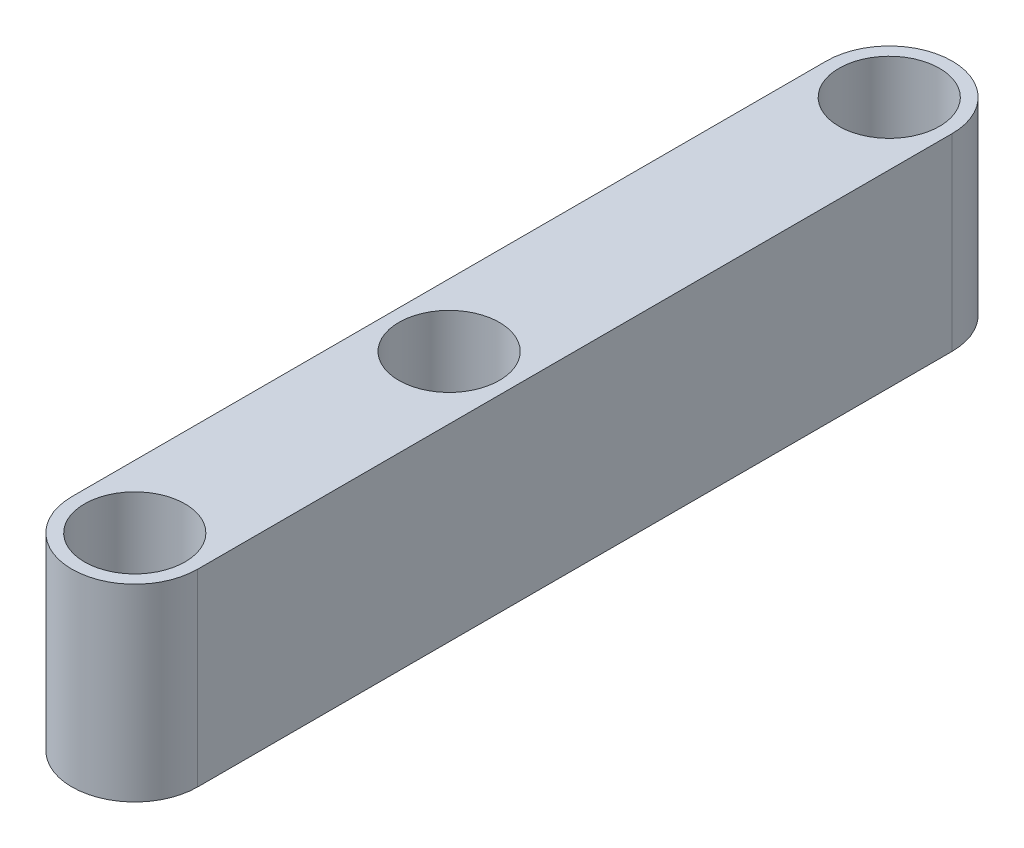
ISO-10303-21;
HEADER;
FILE_DESCRIPTION(('STEP AP214'),'2;1');
FILE_NAME('part.step','',(''),(''),'','','');
FILE_SCHEMA(('AUTOMOTIVE_DESIGN { 1 0 10303 214 1 1 1 1 }'));
ENDSEC;
DATA;
#1=APPLICATION_CONTEXT('core data for automotive mechanical design processes');
#2=APPLICATION_PROTOCOL_DEFINITION('international standard','automotive_design',2000,#1);
#3=PRODUCT_CONTEXT('',#1,'mechanical');
#4=PRODUCT('Part','Part','',(#3));
#5=PRODUCT_RELATED_PRODUCT_CATEGORY('part','',(#4));
#6=PRODUCT_DEFINITION_FORMATION('','',#4);
#7=PRODUCT_DEFINITION_CONTEXT('part definition',#1,'design');
#8=PRODUCT_DEFINITION('design','',#6,#7);
#9=PRODUCT_DEFINITION_SHAPE('','',#8);
#10=(LENGTH_UNIT() NAMED_UNIT(*) SI_UNIT(.MILLI.,.METRE.));
#11=(NAMED_UNIT(*) PLANE_ANGLE_UNIT() SI_UNIT($,.RADIAN.));
#12=(NAMED_UNIT(*) SI_UNIT($,.STERADIAN.) SOLID_ANGLE_UNIT());
#13=UNCERTAINTY_MEASURE_WITH_UNIT(LENGTH_MEASURE(1.E-05),#10,'distance_accuracy_value','');
#14=(GEOMETRIC_REPRESENTATION_CONTEXT(3) GLOBAL_UNCERTAINTY_ASSIGNED_CONTEXT((#13)) GLOBAL_UNIT_ASSIGNED_CONTEXT((#10,
#11,#12)) REPRESENTATION_CONTEXT('',''));
#15=CARTESIAN_POINT('',(0.,0.,0.));
#16=DIRECTION('',(0.,0.,1.));
#17=DIRECTION('',(1.,0.,0.));
#18=AXIS2_PLACEMENT_3D('',#15,#16,#17);
#19=CARTESIAN_POINT('',(-36.9175439934916,1.5,0.));
#20=DIRECTION('',(1.,0.,0.));
#21=DIRECTION('',(0.,0.,-1.));
#22=AXIS2_PLACEMENT_3D('',#19,#20,#21);
#23=PLANE('',#22);
#24=DIRECTION('',(0.,0.,1.));
#25=VECTOR('',#24,1.);
#26=CARTESIAN_POINT('',(-36.9175439934916,0.,0.));
#27=LINE('',#26,#25);
#28=CARTESIAN_POINT('',(-36.9175439934916,0.,-30.0020852059679));
#29=VERTEX_POINT('',#28);
#30=CARTESIAN_POINT('',(-36.9175439934916,0.,-24.0020852059679));
#31=VERTEX_POINT('',#30);
#32=EDGE_CURVE('E119',#29,#31,#27,.T.);
#33=ORIENTED_EDGE('',*,*,#32,.T.);
#34=DIRECTION('',(0.,-1.,0.));
#35=VECTOR('',#34,1.);
#36=CARTESIAN_POINT('',(-36.9175439934916,1.5,-24.0020852059679));
#37=LINE('',#36,#35);
#38=CARTESIAN_POINT('',(-36.9175439934916,1.5,-24.0020852059679));
#39=VERTEX_POINT('',#38);
#40=EDGE_CURVE('E11',#39,#31,#37,.T.);
#41=ORIENTED_EDGE('',*,*,#40,.F.);
#42=DIRECTION('',(0.,0.,1.));
#43=VECTOR('',#42,1.);
#44=CARTESIAN_POINT('',(-36.9175439934916,1.5,0.));
#45=LINE('',#44,#43);
#46=CARTESIAN_POINT('',(-36.9175439934916,1.5,-30.0020852059679));
#47=VERTEX_POINT('',#46);
#48=EDGE_CURVE('E88',#47,#39,#45,.T.);
#49=ORIENTED_EDGE('',*,*,#48,.F.);
#50=DIRECTION('',(0.,-1.,0.));
#51=VECTOR('',#50,1.);
#52=CARTESIAN_POINT('',(-36.9175439934916,1.5,-30.0020852059679));
#53=LINE('',#52,#51);
#54=EDGE_CURVE('E103',#47,#29,#53,.T.);
#55=ORIENTED_EDGE('',*,*,#54,.T.);
#56=EDGE_LOOP('',(#33,#41,#49,#55));
#57=FACE_BOUND('',#56,.T.);
#58=ADVANCED_FACE('F39',(#57),#23,.F.);
#59=CARTESIAN_POINT('',(-36.4175439934916,1.5,-24.0020852059679));
#60=DIRECTION('',(0.,-1.,0.));
#61=DIRECTION('',(0.,0.,-1.));
#62=AXIS2_PLACEMENT_3D('',#59,#60,#61);
#63=CYLINDRICAL_SURFACE('',#62,0.5);
#64=CARTESIAN_POINT('',(-36.4175439934916,0.,-24.0020852059679));
#65=DIRECTION('',(0.,1.,0.));
#66=DIRECTION('',(0.,0.,1.));
#67=AXIS2_PLACEMENT_3D('',#64,#65,#66);
#68=CIRCLE('',#67,0.5);
#69=CARTESIAN_POINT('',(-35.9175439934916,0.,-24.0020852059679));
#70=VERTEX_POINT('',#69);
#71=EDGE_CURVE('E94',#31,#70,#68,.T.);
#72=ORIENTED_EDGE('',*,*,#71,.T.);
#73=DIRECTION('',(0.,-1.,0.));
#74=VECTOR('',#73,1.);
#75=CARTESIAN_POINT('',(-35.9175439934916,1.5,-24.0020852059679));
#76=LINE('',#75,#74);
#77=CARTESIAN_POINT('',(-35.9175439934916,1.5,-24.0020852059679));
#78=VERTEX_POINT('',#77);
#79=EDGE_CURVE('E49',#78,#70,#76,.T.);
#80=ORIENTED_EDGE('',*,*,#79,.F.);
#81=CARTESIAN_POINT('',(-36.4175439934916,1.5,-24.0020852059679));
#82=DIRECTION('',(0.,1.,0.));
#83=DIRECTION('',(0.,0.,1.));
#84=AXIS2_PLACEMENT_3D('',#81,#82,#83);
#85=CIRCLE('',#84,0.5);
#86=EDGE_CURVE('E83',#39,#78,#85,.T.);
#87=ORIENTED_EDGE('',*,*,#86,.F.);
#88=ORIENTED_EDGE('',*,*,#40,.T.);
#89=EDGE_LOOP('',(#72,#80,#87,#88));
#90=FACE_BOUND('',#89,.T.);
#91=ADVANCED_FACE('F93',(#90),#63,.T.);
#92=CARTESIAN_POINT('',(-35.9175439934916,1.5,0.));
#93=DIRECTION('',(1.,0.,0.));
#94=DIRECTION('',(0.,0.,-1.));
#95=AXIS2_PLACEMENT_3D('',#92,#93,#94);
#96=PLANE('',#95);
#97=DIRECTION('',(0.,0.,1.));
#98=VECTOR('',#97,1.);
#99=CARTESIAN_POINT('',(-35.9175439934916,0.,0.));
#100=LINE('',#99,#98);
#101=CARTESIAN_POINT('',(-35.9175439934916,0.,-30.0020852059679));
#102=VERTEX_POINT('',#101);
#103=EDGE_CURVE('E125',#102,#70,#100,.T.);
#104=ORIENTED_EDGE('',*,*,#103,.F.);
#105=DIRECTION('',(0.,-1.,0.));
#106=VECTOR('',#105,1.);
#107=CARTESIAN_POINT('',(-35.9175439934916,1.5,-30.0020852059679));
#108=LINE('',#107,#106);
#109=CARTESIAN_POINT('',(-35.9175439934916,1.5,-30.0020852059679));
#110=VERTEX_POINT('',#109);
#111=EDGE_CURVE('E73',#110,#102,#108,.T.);
#112=ORIENTED_EDGE('',*,*,#111,.F.);
#113=DIRECTION('',(0.,0.,1.));
#114=VECTOR('',#113,1.);
#115=CARTESIAN_POINT('',(-35.9175439934916,1.5,0.));
#116=LINE('',#115,#114);
#117=EDGE_CURVE('E86',#110,#78,#116,.T.);
#118=ORIENTED_EDGE('',*,*,#117,.T.);
#119=ORIENTED_EDGE('',*,*,#79,.T.);
#120=EDGE_LOOP('',(#104,#112,#118,#119));
#121=FACE_BOUND('',#120,.T.);
#122=ADVANCED_FACE('F99',(#121),#96,.T.);
#123=CARTESIAN_POINT('',(-36.4175439934916,1.5,-24.0020852059679));
#124=DIRECTION('',(0.,-1.,0.));
#125=DIRECTION('',(0.,0.,-1.));
#126=AXIS2_PLACEMENT_3D('',#123,#124,#125);
#127=CYLINDRICAL_SURFACE('',#126,0.399999999999998);
#128=CARTESIAN_POINT('',(-36.4175439934916,1.5,-24.0020852059679));
#129=DIRECTION('',(0.,1.,0.));
#130=DIRECTION('',(0.,0.,1.));
#131=AXIS2_PLACEMENT_3D('',#128,#129,#130);
#132=CIRCLE('',#131,0.399999999999998);
#133=CARTESIAN_POINT('',(-36.4175439934916,1.5,-23.6020852059679));
#134=VERTEX_POINT('',#133);
#135=EDGE_CURVE('E177',#134,#134,#132,.T.);
#136=ORIENTED_EDGE('',*,*,#135,.T.);
#137=EDGE_LOOP('',(#136));
#138=FACE_BOUND('',#137,.T.);
#139=CARTESIAN_POINT('',(-36.4175439934916,0.,-24.0020852059679));
#140=DIRECTION('',(0.,1.,0.));
#141=DIRECTION('',(0.,0.,1.));
#142=AXIS2_PLACEMENT_3D('',#139,#140,#141);
#143=CIRCLE('',#142,0.399999999999998);
#144=CARTESIAN_POINT('',(-36.4175439934916,0.,-23.6020852059679));
#145=VERTEX_POINT('',#144);
#146=EDGE_CURVE('E115',#145,#145,#143,.T.);
#147=ORIENTED_EDGE('',*,*,#146,.F.);
#148=EDGE_LOOP('',(#147));
#149=FACE_BOUND('',#148,.T.);
#150=ADVANCED_FACE('F157',(#138,#149),#127,.F.);
#151=CARTESIAN_POINT('',(-36.4175439934916,1.5,-30.0020852059679));
#152=DIRECTION('',(0.,-1.,0.));
#153=DIRECTION('',(0.,0.,-1.));
#154=AXIS2_PLACEMENT_3D('',#151,#152,#153);
#155=CYLINDRICAL_SURFACE('',#154,0.399999999999998);
#156=CARTESIAN_POINT('',(-36.4175439934916,1.5,-30.0020852059679));
#157=DIRECTION('',(0.,1.,0.));
#158=DIRECTION('',(0.,0.,1.));
#159=AXIS2_PLACEMENT_3D('',#156,#157,#158);
#160=CIRCLE('',#159,0.399999999999998);
#161=CARTESIAN_POINT('',(-36.4175439934916,1.5,-29.6020852059679));
#162=VERTEX_POINT('',#161);
#163=EDGE_CURVE('E170',#162,#162,#160,.T.);
#164=ORIENTED_EDGE('',*,*,#163,.T.);
#165=EDGE_LOOP('',(#164));
#166=FACE_BOUND('',#165,.T.);
#167=CARTESIAN_POINT('',(-36.4175439934916,0.,-30.0020852059679));
#168=DIRECTION('',(0.,1.,0.));
#169=DIRECTION('',(0.,0.,1.));
#170=AXIS2_PLACEMENT_3D('',#167,#168,#169);
#171=CIRCLE('',#170,0.399999999999998);
#172=CARTESIAN_POINT('',(-36.4175439934916,0.,-29.6020852059679));
#173=VERTEX_POINT('',#172);
#174=EDGE_CURVE('E111',#173,#173,#171,.T.);
#175=ORIENTED_EDGE('',*,*,#174,.F.);
#176=EDGE_LOOP('',(#175));
#177=FACE_BOUND('',#176,.T.);
#178=ADVANCED_FACE('F159',(#166,#177),#155,.F.);
#179=CARTESIAN_POINT('',(-36.4175439934916,1.5,-26.5020852059679));
#180=DIRECTION('',(0.,-1.,0.));
#181=DIRECTION('',(0.,0.,-1.));
#182=AXIS2_PLACEMENT_3D('',#179,#180,#181);
#183=CYLINDRICAL_SURFACE('',#182,0.399999999999998);
#184=CARTESIAN_POINT('',(-36.4175439934916,1.5,-26.5020852059679));
#185=DIRECTION('',(0.,1.,0.));
#186=DIRECTION('',(0.,0.,1.));
#187=AXIS2_PLACEMENT_3D('',#184,#185,#186);
#188=CIRCLE('',#187,0.399999999999998);
#189=CARTESIAN_POINT('',(-36.4175439934916,1.5,-26.1020852059679));
#190=VERTEX_POINT('',#189);
#191=EDGE_CURVE('E130',#190,#190,#188,.T.);
#192=ORIENTED_EDGE('',*,*,#191,.T.);
#193=EDGE_LOOP('',(#192));
#194=FACE_BOUND('',#193,.T.);
#195=CARTESIAN_POINT('',(-36.4175439934916,0.,-26.5020852059679));
#196=DIRECTION('',(0.,1.,0.));
#197=DIRECTION('',(0.,0.,1.));
#198=AXIS2_PLACEMENT_3D('',#195,#196,#197);
#199=CIRCLE('',#198,0.399999999999998);
#200=CARTESIAN_POINT('',(-36.4175439934916,0.,-26.1020852059679));
#201=VERTEX_POINT('',#200);
#202=EDGE_CURVE('E107',#201,#201,#199,.T.);
#203=ORIENTED_EDGE('',*,*,#202,.F.);
#204=EDGE_LOOP('',(#203));
#205=FACE_BOUND('',#204,.T.);
#206=ADVANCED_FACE('F41',(#194,#205),#183,.F.);
#207=CARTESIAN_POINT('',(-36.4175439934916,1.5,-30.0020852059679));
#208=DIRECTION('',(0.,-1.,0.));
#209=DIRECTION('',(0.,0.,-1.));
#210=AXIS2_PLACEMENT_3D('',#207,#208,#209);
#211=CYLINDRICAL_SURFACE('',#210,0.5);
#212=CARTESIAN_POINT('',(-36.4175439934916,0.,-30.0020852059679));
#213=DIRECTION('',(0.,1.,0.));
#214=DIRECTION('',(0.,0.,1.));
#215=AXIS2_PLACEMENT_3D('',#212,#213,#214);
#216=CIRCLE('',#215,0.5);
#217=EDGE_CURVE('E76',#102,#29,#216,.T.);
#218=ORIENTED_EDGE('',*,*,#217,.T.);
#219=ORIENTED_EDGE('',*,*,#54,.F.);
#220=CARTESIAN_POINT('',(-36.4175439934916,1.5,-30.0020852059679));
#221=DIRECTION('',(0.,1.,0.));
#222=DIRECTION('',(0.,0.,1.));
#223=AXIS2_PLACEMENT_3D('',#220,#221,#222);
#224=CIRCLE('',#223,0.5);
#225=EDGE_CURVE('E57',#110,#47,#224,.T.);
#226=ORIENTED_EDGE('',*,*,#225,.F.);
#227=ORIENTED_EDGE('',*,*,#111,.T.);
#228=EDGE_LOOP('',(#218,#219,#226,#227));
#229=FACE_BOUND('',#228,.T.);
#230=ADVANCED_FACE('F144',(#229),#211,.T.);
#231=CARTESIAN_POINT('',(0.,1.5,0.));
#232=DIRECTION('',(0.,1.,0.));
#233=DIRECTION('',(0.,0.,1.));
#234=AXIS2_PLACEMENT_3D('',#231,#232,#233);
#235=PLANE('',#234);
#236=ORIENTED_EDGE('',*,*,#191,.F.);
#237=EDGE_LOOP('',(#236));
#238=FACE_BOUND('',#237,.T.);
#239=ORIENTED_EDGE('',*,*,#163,.F.);
#240=EDGE_LOOP('',(#239));
#241=FACE_BOUND('',#240,.T.);
#242=ORIENTED_EDGE('',*,*,#135,.F.);
#243=EDGE_LOOP('',(#242));
#244=FACE_BOUND('',#243,.T.);
#245=ORIENTED_EDGE('',*,*,#48,.T.);
#246=ORIENTED_EDGE('',*,*,#86,.T.);
#247=ORIENTED_EDGE('',*,*,#117,.F.);
#248=ORIENTED_EDGE('',*,*,#225,.T.);
#249=EDGE_LOOP('',(#245,#246,#247,#248));
#250=FACE_BOUND('',#249,.T.);
#251=ADVANCED_FACE('F84',(#238,#241,#244,#250),#235,.T.);
#252=CARTESIAN_POINT('',(0.,0.,0.));
#253=DIRECTION('',(0.,1.,0.));
#254=DIRECTION('',(0.,0.,1.));
#255=AXIS2_PLACEMENT_3D('',#252,#253,#254);
#256=PLANE('',#255);
#257=ORIENTED_EDGE('',*,*,#202,.T.);
#258=EDGE_LOOP('',(#257));
#259=FACE_BOUND('',#258,.T.);
#260=ORIENTED_EDGE('',*,*,#174,.T.);
#261=EDGE_LOOP('',(#260));
#262=FACE_BOUND('',#261,.T.);
#263=ORIENTED_EDGE('',*,*,#146,.T.);
#264=EDGE_LOOP('',(#263));
#265=FACE_BOUND('',#264,.T.);
#266=ORIENTED_EDGE('',*,*,#32,.F.);
#267=ORIENTED_EDGE('',*,*,#217,.F.);
#268=ORIENTED_EDGE('',*,*,#103,.T.);
#269=ORIENTED_EDGE('',*,*,#71,.F.);
#270=EDGE_LOOP('',(#266,#267,#268,#269));
#271=FACE_BOUND('',#270,.T.);
#272=ADVANCED_FACE('F137',(#259,#262,#265,#271),#256,.F.);
#273=CLOSED_SHELL('',(#58,#91,#122,#150,#178,#206,#230,#251,#272));
#274=MANIFOLD_SOLID_BREP('B2',#273);
#275=ADVANCED_BREP_SHAPE_REPRESENTATION('',(#18,#274),#14);
#276=SHAPE_DEFINITION_REPRESENTATION(#9,#275);
ENDSEC;
END-ISO-10303-21;
